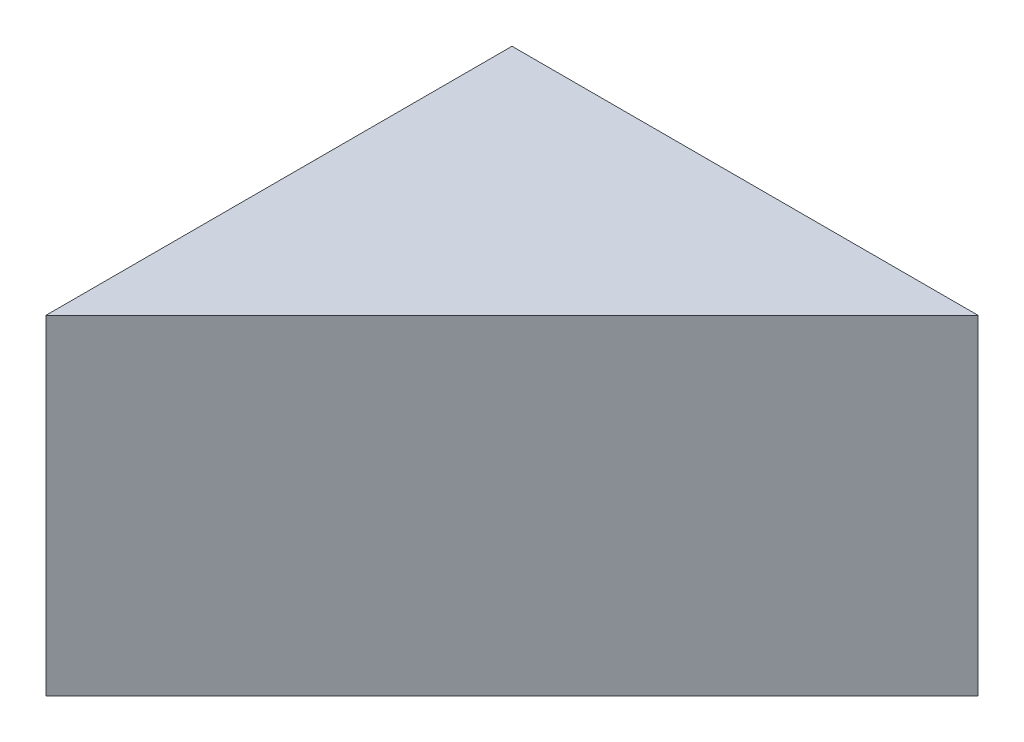
ISO-10303-21;
HEADER;
FILE_DESCRIPTION(('STEP AP214'),'2;1');
FILE_NAME('part.step','',(''),(''),'','','');
FILE_SCHEMA(('AUTOMOTIVE_DESIGN { 1 0 10303 214 1 1 1 1 }'));
ENDSEC;
DATA;
#1=APPLICATION_CONTEXT('core data for automotive mechanical design processes');
#2=APPLICATION_PROTOCOL_DEFINITION('international standard','automotive_design',2000,#1);
#3=PRODUCT_CONTEXT('',#1,'mechanical');
#4=PRODUCT('Part','Part','',(#3));
#5=PRODUCT_RELATED_PRODUCT_CATEGORY('part','',(#4));
#6=PRODUCT_DEFINITION_FORMATION('','',#4);
#7=PRODUCT_DEFINITION_CONTEXT('part definition',#1,'design');
#8=PRODUCT_DEFINITION('design','',#6,#7);
#9=PRODUCT_DEFINITION_SHAPE('','',#8);
#10=(LENGTH_UNIT() NAMED_UNIT(*) SI_UNIT(.MILLI.,.METRE.));
#11=(NAMED_UNIT(*) PLANE_ANGLE_UNIT() SI_UNIT($,.RADIAN.));
#12=(NAMED_UNIT(*) SI_UNIT($,.STERADIAN.) SOLID_ANGLE_UNIT());
#13=UNCERTAINTY_MEASURE_WITH_UNIT(LENGTH_MEASURE(1.E-05),#10,'distance_accuracy_value','');
#14=(GEOMETRIC_REPRESENTATION_CONTEXT(3) GLOBAL_UNCERTAINTY_ASSIGNED_CONTEXT((#13)) GLOBAL_UNIT_ASSIGNED_CONTEXT((#10,
#11,#12)) REPRESENTATION_CONTEXT('',''));
#15=CARTESIAN_POINT('',(0.,0.,0.));
#16=DIRECTION('',(0.,0.,1.));
#17=DIRECTION('',(1.,0.,0.));
#18=AXIS2_PLACEMENT_3D('',#15,#16,#17);
#19=CARTESIAN_POINT('',(14.1421356237309,5.,0.));
#20=DIRECTION('',(0.,0.,1.));
#21=DIRECTION('',(1.,0.,0.));
#22=AXIS2_PLACEMENT_3D('',#19,#20,#21);
#23=PLANE('',#22);
#24=DIRECTION('',(-1.,0.,0.));
#25=VECTOR('',#24,1.);
#26=CARTESIAN_POINT('',(14.1421356237309,-5.,0.));
#27=LINE('',#26,#25);
#28=CARTESIAN_POINT('',(14.1421356237309,-5.,0.));
#29=VERTEX_POINT('',#28);
#30=CARTESIAN_POINT('',(0.,-5.,0.));
#31=VERTEX_POINT('',#30);
#32=EDGE_CURVE('E80',#29,#31,#27,.T.);
#33=ORIENTED_EDGE('',*,*,#32,.T.);
#34=DIRECTION('',(0.,-1.,0.));
#35=VECTOR('',#34,1.);
#36=CARTESIAN_POINT('',(0.,5.,0.));
#37=LINE('',#36,#35);
#38=CARTESIAN_POINT('',(0.,5.,0.));
#39=VERTEX_POINT('',#38);
#40=EDGE_CURVE('E11',#39,#31,#37,.T.);
#41=ORIENTED_EDGE('',*,*,#40,.F.);
#42=DIRECTION('',(-1.,0.,0.));
#43=VECTOR('',#42,1.);
#44=CARTESIAN_POINT('',(14.1421356237309,5.,0.));
#45=LINE('',#44,#43);
#46=CARTESIAN_POINT('',(14.1421356237309,5.,0.));
#47=VERTEX_POINT('',#46);
#48=EDGE_CURVE('E73',#47,#39,#45,.T.);
#49=ORIENTED_EDGE('',*,*,#48,.F.);
#50=DIRECTION('',(0.,-1.,0.));
#51=VECTOR('',#50,1.);
#52=CARTESIAN_POINT('',(14.1421356237309,5.,0.));
#53=LINE('',#52,#51);
#54=EDGE_CURVE('E81',#47,#29,#53,.T.);
#55=ORIENTED_EDGE('',*,*,#54,.T.);
#56=EDGE_LOOP('',(#33,#41,#49,#55));
#57=FACE_BOUND('',#56,.T.);
#58=ADVANCED_FACE('F33',(#57),#23,.F.);
#59=CARTESIAN_POINT('',(0.,5.,0.));
#60=DIRECTION('',(1.,0.,0.));
#61=DIRECTION('',(0.,0.,-1.));
#62=AXIS2_PLACEMENT_3D('',#59,#60,#61);
#63=PLANE('',#62);
#64=DIRECTION('',(0.,0.,1.));
#65=VECTOR('',#64,1.);
#66=CARTESIAN_POINT('',(0.,-5.,0.));
#67=LINE('',#66,#65);
#68=CARTESIAN_POINT('',(0.,-5.,14.142135623731));
#69=VERTEX_POINT('',#68);
#70=EDGE_CURVE('E61',#31,#69,#67,.T.);
#71=ORIENTED_EDGE('',*,*,#70,.T.);
#72=DIRECTION('',(0.,-1.,0.));
#73=VECTOR('',#72,1.);
#74=CARTESIAN_POINT('',(0.,5.,14.142135623731));
#75=LINE('',#74,#73);
#76=CARTESIAN_POINT('',(0.,5.,14.142135623731));
#77=VERTEX_POINT('',#76);
#78=EDGE_CURVE('E41',#77,#69,#75,.T.);
#79=ORIENTED_EDGE('',*,*,#78,.F.);
#80=DIRECTION('',(0.,0.,1.));
#81=VECTOR('',#80,1.);
#82=CARTESIAN_POINT('',(0.,5.,0.));
#83=LINE('',#82,#81);
#84=EDGE_CURVE('E69',#39,#77,#83,.T.);
#85=ORIENTED_EDGE('',*,*,#84,.F.);
#86=ORIENTED_EDGE('',*,*,#40,.T.);
#87=EDGE_LOOP('',(#71,#79,#85,#86));
#88=FACE_BOUND('',#87,.T.);
#89=ADVANCED_FACE('F70',(#88),#63,.F.);
#90=CARTESIAN_POINT('',(0.,5.,14.142135623731));
#91=DIRECTION('',(-0.707106781186551,0.,-0.707106781186544));
#92=DIRECTION('',(-0.707106781186544,0.,0.707106781186551));
#93=AXIS2_PLACEMENT_3D('',#90,#91,#92);
#94=PLANE('',#93);
#95=DIRECTION('',(0.707106781186544,0.,-0.707106781186551));
#96=VECTOR('',#95,1.);
#97=CARTESIAN_POINT('',(0.,-5.,14.142135623731));
#98=LINE('',#97,#96);
#99=EDGE_CURVE('E66',#69,#29,#98,.T.);
#100=ORIENTED_EDGE('',*,*,#99,.T.);
#101=ORIENTED_EDGE('',*,*,#54,.F.);
#102=DIRECTION('',(0.707106781186544,0.,-0.707106781186551));
#103=VECTOR('',#102,1.);
#104=CARTESIAN_POINT('',(0.,5.,14.142135623731));
#105=LINE('',#104,#103);
#106=EDGE_CURVE('E49',#77,#47,#105,.T.);
#107=ORIENTED_EDGE('',*,*,#106,.F.);
#108=ORIENTED_EDGE('',*,*,#78,.T.);
#109=EDGE_LOOP('',(#100,#101,#107,#108));
#110=FACE_BOUND('',#109,.T.);
#111=ADVANCED_FACE('F88',(#110),#94,.F.);
#112=CARTESIAN_POINT('',(0.,5.,0.));
#113=DIRECTION('',(0.,1.,0.));
#114=DIRECTION('',(0.,0.,1.));
#115=AXIS2_PLACEMENT_3D('',#112,#113,#114);
#116=PLANE('',#115);
#117=ORIENTED_EDGE('',*,*,#48,.T.);
#118=ORIENTED_EDGE('',*,*,#84,.T.);
#119=ORIENTED_EDGE('',*,*,#106,.T.);
#120=EDGE_LOOP('',(#117,#118,#119));
#121=FACE_BOUND('',#120,.T.);
#122=ADVANCED_FACE('F76',(#121),#116,.T.);
#123=CARTESIAN_POINT('',(0.,-5.,0.));
#124=DIRECTION('',(0.,1.,0.));
#125=DIRECTION('',(0.,0.,1.));
#126=AXIS2_PLACEMENT_3D('',#123,#124,#125);
#127=PLANE('',#126);
#128=ORIENTED_EDGE('',*,*,#32,.F.);
#129=ORIENTED_EDGE('',*,*,#99,.F.);
#130=ORIENTED_EDGE('',*,*,#70,.F.);
#131=EDGE_LOOP('',(#128,#129,#130));
#132=FACE_BOUND('',#131,.T.);
#133=ADVANCED_FACE('F89',(#132),#127,.F.);
#134=CLOSED_SHELL('',(#58,#89,#111,#122,#133));
#135=MANIFOLD_SOLID_BREP('B2',#134);
#136=ADVANCED_BREP_SHAPE_REPRESENTATION('',(#18,#135),#14);
#137=SHAPE_DEFINITION_REPRESENTATION(#9,#136);
ENDSEC;
END-ISO-10303-21;
